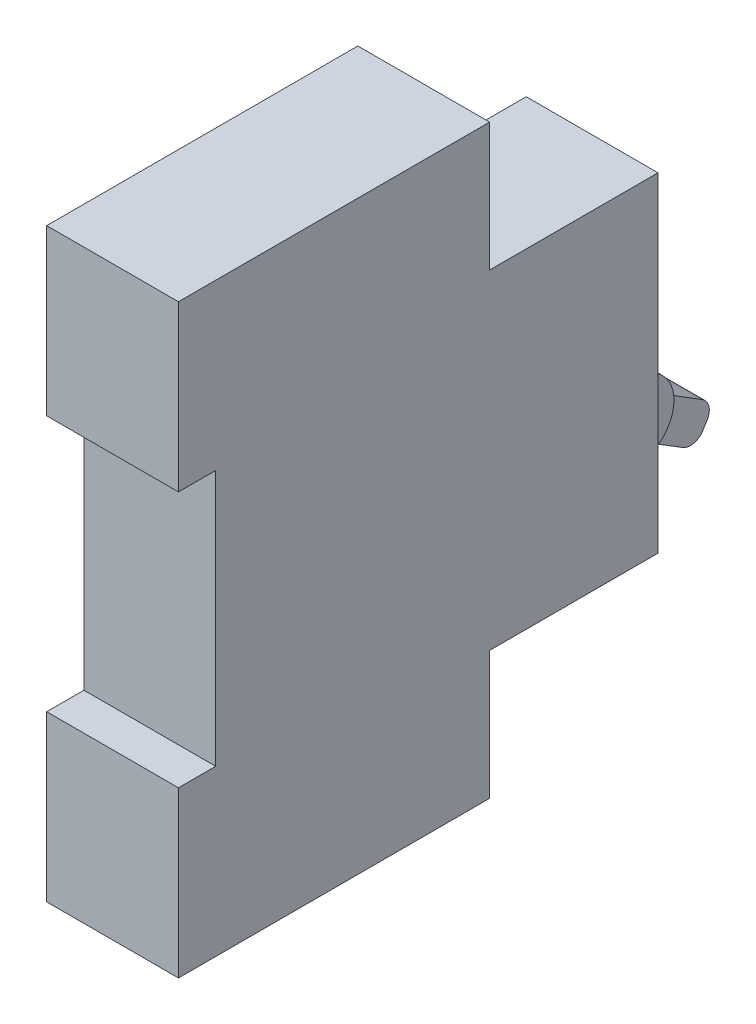
ISO-10303-21;
HEADER;
FILE_DESCRIPTION(('STEP AP214'),'2;1');
FILE_NAME('part.step','',(''),(''),'','','');
FILE_SCHEMA(('AUTOMOTIVE_DESIGN { 1 0 10303 214 1 1 1 1 }'));
ENDSEC;
DATA;
#1=APPLICATION_CONTEXT('core data for automotive mechanical design processes');
#2=APPLICATION_PROTOCOL_DEFINITION('international standard','automotive_design',2000,#1);
#3=PRODUCT_CONTEXT('',#1,'mechanical');
#4=PRODUCT('Part','Part','',(#3));
#5=PRODUCT_RELATED_PRODUCT_CATEGORY('part','',(#4));
#6=PRODUCT_DEFINITION_FORMATION('','',#4);
#7=PRODUCT_DEFINITION_CONTEXT('part definition',#1,'design');
#8=PRODUCT_DEFINITION('design','',#6,#7);
#9=PRODUCT_DEFINITION_SHAPE('','',#8);
#10=(LENGTH_UNIT() NAMED_UNIT(*) SI_UNIT(.MILLI.,.METRE.));
#11=(NAMED_UNIT(*) PLANE_ANGLE_UNIT() SI_UNIT($,.RADIAN.));
#12=(NAMED_UNIT(*) SI_UNIT($,.STERADIAN.) SOLID_ANGLE_UNIT());
#13=UNCERTAINTY_MEASURE_WITH_UNIT(LENGTH_MEASURE(1.E-05),#10,'distance_accuracy_value','');
#14=(GEOMETRIC_REPRESENTATION_CONTEXT(3) GLOBAL_UNCERTAINTY_ASSIGNED_CONTEXT((#13)) GLOBAL_UNIT_ASSIGNED_CONTEXT((#10,
#11,#12)) REPRESENTATION_CONTEXT('',''));
#15=CARTESIAN_POINT('',(0.,0.,0.));
#16=DIRECTION('',(0.,0.,1.));
#17=DIRECTION('',(1.,0.,0.));
#18=AXIS2_PLACEMENT_3D('',#15,#16,#17);
#19=CARTESIAN_POINT('',(-9.,22.5,-65.5));
#20=DIRECTION('',(0.,0.,-1.));
#21=DIRECTION('',(-1.,0.,0.));
#22=AXIS2_PLACEMENT_3D('',#19,#20,#21);
#23=PLANE('',#22);
#24=DIRECTION('',(1.,0.,0.));
#25=VECTOR('',#24,1.);
#26=CARTESIAN_POINT('',(-9.,22.5,-65.5));
#27=LINE('',#26,#25);
#28=CARTESIAN_POINT('',(-9.,22.5,-65.5));
#29=VERTEX_POINT('',#28);
#30=CARTESIAN_POINT('',(9.,22.5,-65.5));
#31=VERTEX_POINT('',#30);
#32=EDGE_CURVE('E328',#29,#31,#27,.T.);
#33=ORIENTED_EDGE('',*,*,#32,.T.);
#34=DIRECTION('',(0.,1.,0.));
#35=VECTOR('',#34,1.);
#36=CARTESIAN_POINT('',(9.,22.5,-65.5));
#37=LINE('',#36,#35);
#38=CARTESIAN_POINT('',(9.,-22.5,-65.5));
#39=VERTEX_POINT('',#38);
#40=EDGE_CURVE('E269',#39,#31,#37,.T.);
#41=ORIENTED_EDGE('',*,*,#40,.F.);
#42=DIRECTION('',(1.,0.,0.));
#43=VECTOR('',#42,1.);
#44=CARTESIAN_POINT('',(-9.,-22.5,-65.5));
#45=LINE('',#44,#43);
#46=CARTESIAN_POINT('',(-9.,-22.5,-65.5));
#47=VERTEX_POINT('',#46);
#48=EDGE_CURVE('E330',#47,#39,#45,.T.);
#49=ORIENTED_EDGE('',*,*,#48,.F.);
#50=DIRECTION('',(0.,1.,0.));
#51=VECTOR('',#50,1.);
#52=CARTESIAN_POINT('',(-9.,22.5,-65.5));
#53=LINE('',#52,#51);
#54=EDGE_CURVE('E305',#47,#29,#53,.T.);
#55=ORIENTED_EDGE('',*,*,#54,.T.);
#56=EDGE_LOOP('',(#33,#41,#49,#55));
#57=FACE_BOUND('',#56,.T.);
#58=DIRECTION('',(1.,0.,0.));
#59=VECTOR('',#58,1.);
#60=CARTESIAN_POINT('',(-6.,-3.30776483406985,-65.5));
#61=LINE('',#60,#59);
#62=CARTESIAN_POINT('',(-6.,-3.30776483406985,-65.5));
#63=VERTEX_POINT('',#62);
#64=CARTESIAN_POINT('',(6.,-3.30776483406985,-65.5));
#65=VERTEX_POINT('',#64);
#66=EDGE_CURVE('E243',#63,#65,#61,.T.);
#67=ORIENTED_EDGE('',*,*,#66,.F.);
#68=DIRECTION('',(0.,-1.,0.));
#69=VECTOR('',#68,1.);
#70=CARTESIAN_POINT('',(-6.,-3.30776483406985,-65.5));
#71=LINE('',#70,#69);
#72=CARTESIAN_POINT('',(-6.,-13.6686350822825,-65.5));
#73=VERTEX_POINT('',#72);
#74=EDGE_CURVE('E241',#63,#73,#71,.T.);
#75=ORIENTED_EDGE('',*,*,#74,.T.);
#76=DIRECTION('',(1.,0.,0.));
#77=VECTOR('',#76,1.);
#78=CARTESIAN_POINT('',(-6.,-13.6686350822825,-65.5));
#79=LINE('',#78,#77);
#80=CARTESIAN_POINT('',(6.,-13.6686350822825,-65.5));
#81=VERTEX_POINT('',#80);
#82=EDGE_CURVE('E244',#73,#81,#79,.T.);
#83=ORIENTED_EDGE('',*,*,#82,.T.);
#84=DIRECTION('',(0.,-1.,0.));
#85=VECTOR('',#84,1.);
#86=CARTESIAN_POINT('',(6.,-3.30776483406985,-65.5));
#87=LINE('',#86,#85);
#88=EDGE_CURVE('E235',#65,#81,#87,.T.);
#89=ORIENTED_EDGE('',*,*,#88,.F.);
#90=EDGE_LOOP('',(#67,#75,#83,#89));
#91=FACE_BOUND('',#90,.T.);
#92=ADVANCED_FACE('F35',(#57,#91),#23,.T.);
#93=CARTESIAN_POINT('',(-9.,17.5,0.));
#94=DIRECTION('',(0.,-1.,0.));
#95=DIRECTION('',(0.,0.,-1.));
#96=AXIS2_PLACEMENT_3D('',#93,#94,#95);
#97=PLANE('',#96);
#98=DIRECTION('',(1.,0.,0.));
#99=VECTOR('',#98,1.);
#100=CARTESIAN_POINT('',(-9.,17.5,-5.08495999200712));
#101=LINE('',#100,#99);
#102=CARTESIAN_POINT('',(-9.,17.5,-5.08495999200712));
#103=VERTEX_POINT('',#102);
#104=CARTESIAN_POINT('',(9.,17.5,-5.08495999200712));
#105=VERTEX_POINT('',#104);
#106=EDGE_CURVE('E320',#103,#105,#101,.T.);
#107=ORIENTED_EDGE('',*,*,#106,.T.);
#108=DIRECTION('',(0.,0.,-1.));
#109=VECTOR('',#108,1.);
#110=CARTESIAN_POINT('',(9.,17.5,0.));
#111=LINE('',#110,#109);
#112=CARTESIAN_POINT('',(9.,17.5,0.));
#113=VERTEX_POINT('',#112);
#114=EDGE_CURVE('E246',#113,#105,#111,.T.);
#115=ORIENTED_EDGE('',*,*,#114,.F.);
#116=DIRECTION('',(1.,0.,0.));
#117=VECTOR('',#116,1.);
#118=CARTESIAN_POINT('',(-9.,17.5,0.));
#119=LINE('',#118,#117);
#120=CARTESIAN_POINT('',(-9.,17.5,0.));
#121=VERTEX_POINT('',#120);
#122=EDGE_CURVE('E182',#121,#113,#119,.T.);
#123=ORIENTED_EDGE('',*,*,#122,.F.);
#124=DIRECTION('',(0.,0.,-1.));
#125=VECTOR('',#124,1.);
#126=CARTESIAN_POINT('',(-9.,17.5,0.));
#127=LINE('',#126,#125);
#128=EDGE_CURVE('E284',#121,#103,#127,.T.);
#129=ORIENTED_EDGE('',*,*,#128,.T.);
#130=EDGE_LOOP('',(#107,#115,#123,#129));
#131=FACE_BOUND('',#130,.T.);
#132=ADVANCED_FACE('F345',(#131),#97,.T.);
#133=CARTESIAN_POINT('',(-9.,17.5,0.));
#134=DIRECTION('',(0.,0.,1.));
#135=DIRECTION('',(0.,-1.,0.));
#136=AXIS2_PLACEMENT_3D('',#133,#134,#135);
#137=PLANE('',#136);
#138=ORIENTED_EDGE('',*,*,#122,.T.);
#139=DIRECTION('',(0.,-1.,0.));
#140=VECTOR('',#139,1.);
#141=CARTESIAN_POINT('',(9.,17.5,0.));
#142=LINE('',#141,#140);
#143=CARTESIAN_POINT('',(9.,40.,0.));
#144=VERTEX_POINT('',#143);
#145=EDGE_CURVE('E281',#144,#113,#142,.T.);
#146=ORIENTED_EDGE('',*,*,#145,.F.);
#147=DIRECTION('',(1.,0.,0.));
#148=VECTOR('',#147,1.);
#149=CARTESIAN_POINT('',(-9.,40.,0.));
#150=LINE('',#149,#148);
#151=CARTESIAN_POINT('',(-9.,40.,0.));
#152=VERTEX_POINT('',#151);
#153=EDGE_CURVE('E322',#152,#144,#150,.T.);
#154=ORIENTED_EDGE('',*,*,#153,.F.);
#155=DIRECTION('',(0.,-1.,0.));
#156=VECTOR('',#155,1.);
#157=CARTESIAN_POINT('',(-9.,17.5,0.));
#158=LINE('',#157,#156);
#159=EDGE_CURVE('E317',#152,#121,#158,.T.);
#160=ORIENTED_EDGE('',*,*,#159,.T.);
#161=EDGE_LOOP('',(#138,#146,#154,#160));
#162=FACE_BOUND('',#161,.T.);
#163=ADVANCED_FACE('F356',(#162),#137,.T.);
#164=CARTESIAN_POINT('',(-9.,40.,0.));
#165=DIRECTION('',(0.,1.,0.));
#166=DIRECTION('',(0.,0.,1.));
#167=AXIS2_PLACEMENT_3D('',#164,#165,#166);
#168=PLANE('',#167);
#169=ORIENTED_EDGE('',*,*,#153,.T.);
#170=DIRECTION('',(0.,0.,1.));
#171=VECTOR('',#170,1.);
#172=CARTESIAN_POINT('',(9.,40.,0.));
#173=LINE('',#172,#171);
#174=CARTESIAN_POINT('',(9.,40.,-42.5));
#175=VERTEX_POINT('',#174);
#176=EDGE_CURVE('E278',#175,#144,#173,.T.);
#177=ORIENTED_EDGE('',*,*,#176,.F.);
#178=DIRECTION('',(1.,0.,0.));
#179=VECTOR('',#178,1.);
#180=CARTESIAN_POINT('',(-9.,40.,-42.5));
#181=LINE('',#180,#179);
#182=CARTESIAN_POINT('',(-9.,40.,-42.5));
#183=VERTEX_POINT('',#182);
#184=EDGE_CURVE('E324',#183,#175,#181,.T.);
#185=ORIENTED_EDGE('',*,*,#184,.F.);
#186=DIRECTION('',(0.,0.,1.));
#187=VECTOR('',#186,1.);
#188=CARTESIAN_POINT('',(-9.,40.,0.));
#189=LINE('',#188,#187);
#190=EDGE_CURVE('E314',#183,#152,#189,.T.);
#191=ORIENTED_EDGE('',*,*,#190,.T.);
#192=EDGE_LOOP('',(#169,#177,#185,#191));
#193=FACE_BOUND('',#192,.T.);
#194=ADVANCED_FACE('F393',(#193),#168,.T.);
#195=CARTESIAN_POINT('',(-9.,40.,-42.5));
#196=DIRECTION('',(0.,0.,-1.));
#197=DIRECTION('',(-1.,0.,0.));
#198=AXIS2_PLACEMENT_3D('',#195,#196,#197);
#199=PLANE('',#198);
#200=ORIENTED_EDGE('',*,*,#184,.T.);
#201=DIRECTION('',(0.,1.,0.));
#202=VECTOR('',#201,1.);
#203=CARTESIAN_POINT('',(9.,40.,-42.5));
#204=LINE('',#203,#202);
#205=CARTESIAN_POINT('',(9.,22.5,-42.5));
#206=VERTEX_POINT('',#205);
#207=EDGE_CURVE('E275',#206,#175,#204,.T.);
#208=ORIENTED_EDGE('',*,*,#207,.F.);
#209=DIRECTION('',(1.,0.,0.));
#210=VECTOR('',#209,1.);
#211=CARTESIAN_POINT('',(-9.,22.5,-42.5));
#212=LINE('',#211,#210);
#213=CARTESIAN_POINT('',(-9.,22.5,-42.5));
#214=VERTEX_POINT('',#213);
#215=EDGE_CURVE('E326',#214,#206,#212,.T.);
#216=ORIENTED_EDGE('',*,*,#215,.F.);
#217=DIRECTION('',(0.,1.,0.));
#218=VECTOR('',#217,1.);
#219=CARTESIAN_POINT('',(-9.,40.,-42.5));
#220=LINE('',#219,#218);
#221=EDGE_CURVE('E311',#214,#183,#220,.T.);
#222=ORIENTED_EDGE('',*,*,#221,.T.);
#223=EDGE_LOOP('',(#200,#208,#216,#222));
#224=FACE_BOUND('',#223,.T.);
#225=ADVANCED_FACE('F391',(#224),#199,.T.);
#226=CARTESIAN_POINT('',(-9.,22.5,-42.5));
#227=DIRECTION('',(0.,1.,0.));
#228=DIRECTION('',(0.,0.,1.));
#229=AXIS2_PLACEMENT_3D('',#226,#227,#228);
#230=PLANE('',#229);
#231=ORIENTED_EDGE('',*,*,#215,.T.);
#232=DIRECTION('',(0.,0.,1.));
#233=VECTOR('',#232,1.);
#234=CARTESIAN_POINT('',(9.,22.5,-42.5));
#235=LINE('',#234,#233);
#236=EDGE_CURVE('E272',#31,#206,#235,.T.);
#237=ORIENTED_EDGE('',*,*,#236,.F.);
#238=ORIENTED_EDGE('',*,*,#32,.F.);
#239=DIRECTION('',(0.,0.,1.));
#240=VECTOR('',#239,1.);
#241=CARTESIAN_POINT('',(-9.,22.5,-42.5));
#242=LINE('',#241,#240);
#243=EDGE_CURVE('E308',#29,#214,#242,.T.);
#244=ORIENTED_EDGE('',*,*,#243,.T.);
#245=EDGE_LOOP('',(#231,#237,#238,#244));
#246=FACE_BOUND('',#245,.T.);
#247=ADVANCED_FACE('F387',(#246),#230,.T.);
#248=CARTESIAN_POINT('',(-9.,-22.5,-42.5));
#249=DIRECTION('',(0.,-1.,0.));
#250=DIRECTION('',(0.,0.,-1.));
#251=AXIS2_PLACEMENT_3D('',#248,#249,#250);
#252=PLANE('',#251);
#253=ORIENTED_EDGE('',*,*,#48,.T.);
#254=DIRECTION('',(0.,0.,-1.));
#255=VECTOR('',#254,1.);
#256=CARTESIAN_POINT('',(9.,-22.5,-42.5));
#257=LINE('',#256,#255);
#258=CARTESIAN_POINT('',(9.,-22.5,-42.5));
#259=VERTEX_POINT('',#258);
#260=EDGE_CURVE('E266',#259,#39,#257,.T.);
#261=ORIENTED_EDGE('',*,*,#260,.F.);
#262=DIRECTION('',(1.,0.,0.));
#263=VECTOR('',#262,1.);
#264=CARTESIAN_POINT('',(-9.,-22.5,-42.5));
#265=LINE('',#264,#263);
#266=CARTESIAN_POINT('',(-9.,-22.5,-42.5));
#267=VERTEX_POINT('',#266);
#268=EDGE_CURVE('E332',#267,#259,#265,.T.);
#269=ORIENTED_EDGE('',*,*,#268,.F.);
#270=DIRECTION('',(0.,0.,-1.));
#271=VECTOR('',#270,1.);
#272=CARTESIAN_POINT('',(-9.,-22.5,-42.5));
#273=LINE('',#272,#271);
#274=EDGE_CURVE('E302',#267,#47,#273,.T.);
#275=ORIENTED_EDGE('',*,*,#274,.T.);
#276=EDGE_LOOP('',(#253,#261,#269,#275));
#277=FACE_BOUND('',#276,.T.);
#278=ADVANCED_FACE('F381',(#277),#252,.T.);
#279=CARTESIAN_POINT('',(-9.,-40.,-42.5));
#280=DIRECTION('',(0.,0.,-1.));
#281=DIRECTION('',(-1.,0.,0.));
#282=AXIS2_PLACEMENT_3D('',#279,#280,#281);
#283=PLANE('',#282);
#284=ORIENTED_EDGE('',*,*,#268,.T.);
#285=DIRECTION('',(0.,1.,0.));
#286=VECTOR('',#285,1.);
#287=CARTESIAN_POINT('',(9.,-40.,-42.5));
#288=LINE('',#287,#286);
#289=CARTESIAN_POINT('',(9.,-40.,-42.5));
#290=VERTEX_POINT('',#289);
#291=EDGE_CURVE('E263',#290,#259,#288,.T.);
#292=ORIENTED_EDGE('',*,*,#291,.F.);
#293=DIRECTION('',(1.,0.,0.));
#294=VECTOR('',#293,1.);
#295=CARTESIAN_POINT('',(-9.,-40.,-42.5));
#296=LINE('',#295,#294);
#297=CARTESIAN_POINT('',(-9.,-40.,-42.5));
#298=VERTEX_POINT('',#297);
#299=EDGE_CURVE('E334',#298,#290,#296,.T.);
#300=ORIENTED_EDGE('',*,*,#299,.F.);
#301=DIRECTION('',(0.,1.,0.));
#302=VECTOR('',#301,1.);
#303=CARTESIAN_POINT('',(-9.,-40.,-42.5));
#304=LINE('',#303,#302);
#305=EDGE_CURVE('E299',#298,#267,#304,.T.);
#306=ORIENTED_EDGE('',*,*,#305,.T.);
#307=EDGE_LOOP('',(#284,#292,#300,#306));
#308=FACE_BOUND('',#307,.T.);
#309=ADVANCED_FACE('F376',(#308),#283,.T.);
#310=CARTESIAN_POINT('',(-9.,-40.,0.));
#311=DIRECTION('',(0.,-1.,0.));
#312=DIRECTION('',(0.,0.,-1.));
#313=AXIS2_PLACEMENT_3D('',#310,#311,#312);
#314=PLANE('',#313);
#315=ORIENTED_EDGE('',*,*,#299,.T.);
#316=DIRECTION('',(0.,0.,-1.));
#317=VECTOR('',#316,1.);
#318=CARTESIAN_POINT('',(9.,-40.,0.));
#319=LINE('',#318,#317);
#320=CARTESIAN_POINT('',(9.,-40.,0.));
#321=VERTEX_POINT('',#320);
#322=EDGE_CURVE('E260',#321,#290,#319,.T.);
#323=ORIENTED_EDGE('',*,*,#322,.F.);
#324=DIRECTION('',(1.,0.,0.));
#325=VECTOR('',#324,1.);
#326=CARTESIAN_POINT('',(-9.,-40.,0.));
#327=LINE('',#326,#325);
#328=CARTESIAN_POINT('',(-9.,-40.,0.));
#329=VERTEX_POINT('',#328);
#330=EDGE_CURVE('E336',#329,#321,#327,.T.);
#331=ORIENTED_EDGE('',*,*,#330,.F.);
#332=DIRECTION('',(0.,0.,-1.));
#333=VECTOR('',#332,1.);
#334=CARTESIAN_POINT('',(-9.,-40.,0.));
#335=LINE('',#334,#333);
#336=EDGE_CURVE('E296',#329,#298,#335,.T.);
#337=ORIENTED_EDGE('',*,*,#336,.T.);
#338=EDGE_LOOP('',(#315,#323,#331,#337));
#339=FACE_BOUND('',#338,.T.);
#340=ADVANCED_FACE('F371',(#339),#314,.T.);
#341=CARTESIAN_POINT('',(-9.,-17.5,0.));
#342=DIRECTION('',(0.,0.,1.));
#343=DIRECTION('',(0.,-1.,0.));
#344=AXIS2_PLACEMENT_3D('',#341,#342,#343);
#345=PLANE('',#344);
#346=ORIENTED_EDGE('',*,*,#330,.T.);
#347=DIRECTION('',(0.,-1.,0.));
#348=VECTOR('',#347,1.);
#349=CARTESIAN_POINT('',(9.,-17.5,0.));
#350=LINE('',#349,#348);
#351=CARTESIAN_POINT('',(9.,-17.5,0.));
#352=VERTEX_POINT('',#351);
#353=EDGE_CURVE('E257',#352,#321,#350,.T.);
#354=ORIENTED_EDGE('',*,*,#353,.F.);
#355=DIRECTION('',(1.,0.,0.));
#356=VECTOR('',#355,1.);
#357=CARTESIAN_POINT('',(-9.,-17.5,0.));
#358=LINE('',#357,#356);
#359=CARTESIAN_POINT('',(-9.,-17.5,0.));
#360=VERTEX_POINT('',#359);
#361=EDGE_CURVE('E338',#360,#352,#358,.T.);
#362=ORIENTED_EDGE('',*,*,#361,.F.);
#363=DIRECTION('',(0.,-1.,0.));
#364=VECTOR('',#363,1.);
#365=CARTESIAN_POINT('',(-9.,-17.5,0.));
#366=LINE('',#365,#364);
#367=EDGE_CURVE('E293',#360,#329,#366,.T.);
#368=ORIENTED_EDGE('',*,*,#367,.T.);
#369=EDGE_LOOP('',(#346,#354,#362,#368));
#370=FACE_BOUND('',#369,.T.);
#371=ADVANCED_FACE('F369',(#370),#345,.T.);
#372=CARTESIAN_POINT('',(-9.,-17.5,0.));
#373=DIRECTION('',(0.,1.,0.));
#374=DIRECTION('',(0.,0.,1.));
#375=AXIS2_PLACEMENT_3D('',#372,#373,#374);
#376=PLANE('',#375);
#377=ORIENTED_EDGE('',*,*,#361,.T.);
#378=DIRECTION('',(0.,0.,1.));
#379=VECTOR('',#378,1.);
#380=CARTESIAN_POINT('',(9.,-17.5,0.));
#381=LINE('',#380,#379);
#382=CARTESIAN_POINT('',(9.,-17.5,-5.08495999200712));
#383=VERTEX_POINT('',#382);
#384=EDGE_CURVE('E254',#383,#352,#381,.T.);
#385=ORIENTED_EDGE('',*,*,#384,.F.);
#386=DIRECTION('',(1.,0.,0.));
#387=VECTOR('',#386,1.);
#388=CARTESIAN_POINT('',(-9.,-17.5,-5.08495999200712));
#389=LINE('',#388,#387);
#390=CARTESIAN_POINT('',(-9.,-17.5,-5.08495999200712));
#391=VERTEX_POINT('',#390);
#392=EDGE_CURVE('E340',#391,#383,#389,.T.);
#393=ORIENTED_EDGE('',*,*,#392,.F.);
#394=DIRECTION('',(0.,0.,1.));
#395=VECTOR('',#394,1.);
#396=CARTESIAN_POINT('',(-9.,-17.5,0.));
#397=LINE('',#396,#395);
#398=EDGE_CURVE('E290',#391,#360,#397,.T.);
#399=ORIENTED_EDGE('',*,*,#398,.T.);
#400=EDGE_LOOP('',(#377,#385,#393,#399));
#401=FACE_BOUND('',#400,.T.);
#402=ADVANCED_FACE('F365',(#401),#376,.T.);
#403=CARTESIAN_POINT('',(-9.,17.5,-5.08495999200712));
#404=DIRECTION('',(0.,0.,1.));
#405=DIRECTION('',(1.,0.,0.));
#406=AXIS2_PLACEMENT_3D('',#403,#404,#405);
#407=PLANE('',#406);
#408=ORIENTED_EDGE('',*,*,#392,.T.);
#409=DIRECTION('',(0.,-1.,0.));
#410=VECTOR('',#409,1.);
#411=CARTESIAN_POINT('',(9.,17.5,-5.08495999200712));
#412=LINE('',#411,#410);
#413=EDGE_CURVE('E251',#105,#383,#412,.T.);
#414=ORIENTED_EDGE('',*,*,#413,.F.);
#415=ORIENTED_EDGE('',*,*,#106,.F.);
#416=DIRECTION('',(0.,-1.,0.));
#417=VECTOR('',#416,1.);
#418=CARTESIAN_POINT('',(-9.,17.5,-5.08495999200712));
#419=LINE('',#418,#417);
#420=EDGE_CURVE('E287',#103,#391,#419,.T.);
#421=ORIENTED_EDGE('',*,*,#420,.T.);
#422=EDGE_LOOP('',(#408,#414,#415,#421));
#423=FACE_BOUND('',#422,.T.);
#424=ADVANCED_FACE('F349',(#423),#407,.T.);
#425=CARTESIAN_POINT('',(-9.,0.,0.));
#426=DIRECTION('',(-1.,0.,0.));
#427=DIRECTION('',(0.,0.,1.));
#428=AXIS2_PLACEMENT_3D('',#425,#426,#427);
#429=PLANE('',#428);
#430=ORIENTED_EDGE('',*,*,#128,.F.);
#431=ORIENTED_EDGE('',*,*,#159,.F.);
#432=ORIENTED_EDGE('',*,*,#190,.F.);
#433=ORIENTED_EDGE('',*,*,#221,.F.);
#434=ORIENTED_EDGE('',*,*,#243,.F.);
#435=ORIENTED_EDGE('',*,*,#54,.F.);
#436=ORIENTED_EDGE('',*,*,#274,.F.);
#437=ORIENTED_EDGE('',*,*,#305,.F.);
#438=ORIENTED_EDGE('',*,*,#336,.F.);
#439=ORIENTED_EDGE('',*,*,#367,.F.);
#440=ORIENTED_EDGE('',*,*,#398,.F.);
#441=ORIENTED_EDGE('',*,*,#420,.F.);
#442=EDGE_LOOP('',(#430,#431,#432,#433,#434,#435,#436,#437,#438,#439,#440,#441));
#443=FACE_BOUND('',#442,.T.);
#444=ADVANCED_FACE('F359',(#443),#429,.T.);
#445=CARTESIAN_POINT('',(9.,0.,0.));
#446=DIRECTION('',(-1.,0.,0.));
#447=DIRECTION('',(0.,0.,1.));
#448=AXIS2_PLACEMENT_3D('',#445,#446,#447);
#449=PLANE('',#448);
#450=ORIENTED_EDGE('',*,*,#114,.T.);
#451=ORIENTED_EDGE('',*,*,#413,.T.);
#452=ORIENTED_EDGE('',*,*,#384,.T.);
#453=ORIENTED_EDGE('',*,*,#353,.T.);
#454=ORIENTED_EDGE('',*,*,#322,.T.);
#455=ORIENTED_EDGE('',*,*,#291,.T.);
#456=ORIENTED_EDGE('',*,*,#260,.T.);
#457=ORIENTED_EDGE('',*,*,#40,.T.);
#458=ORIENTED_EDGE('',*,*,#236,.T.);
#459=ORIENTED_EDGE('',*,*,#207,.T.);
#460=ORIENTED_EDGE('',*,*,#176,.T.);
#461=ORIENTED_EDGE('',*,*,#145,.T.);
#462=EDGE_LOOP('',(#450,#451,#452,#453,#454,#455,#456,#457,#458,#459,#460,#461));
#463=FACE_BOUND('',#462,.T.);
#464=ADVANCED_FACE('F352',(#463),#449,.F.);
#465=CARTESIAN_POINT('',(-6.,-8.48819995817616,-65.5));
#466=DIRECTION('',(1.,0.,0.));
#467=DIRECTION('',(0.,0.,-1.));
#468=AXIS2_PLACEMENT_3D('',#465,#466,#467);
#469=CYLINDRICAL_SURFACE('',#468,5.1804351241063);
#470=CARTESIAN_POINT('',(-4.,-8.48819995817616,-65.5));
#471=DIRECTION('',(-1.,0.,0.));
#472=DIRECTION('',(0.,0.,1.));
#473=AXIS2_PLACEMENT_3D('',#470,#471,#472);
#474=CIRCLE('',#473,5.1804351241063);
#475=CARTESIAN_POINT('',(-4.,-13.0330015049833,-67.9862998562551));
#476=VERTEX_POINT('',#475);
#477=CARTESIAN_POINT('',(-4.,-8.70298361467207,-70.6759806854331));
#478=VERTEX_POINT('',#477);
#479=EDGE_CURVE('E198',#476,#478,#474,.F.);
#480=ORIENTED_EDGE('',*,*,#479,.F.);
#481=DIRECTION('',(1.,0.,0.));
#482=VECTOR('',#481,1.);
#483=CARTESIAN_POINT('',(-6.,-13.0330015049833,-67.9862998562551));
#484=LINE('',#483,#482);
#485=CARTESIAN_POINT('',(4.,-13.0330015049833,-67.9862998562551));
#486=VERTEX_POINT('',#485);
#487=EDGE_CURVE('E188',#486,#476,#484,.F.);
#488=ORIENTED_EDGE('',*,*,#487,.F.);
#489=CARTESIAN_POINT('',(4.,-8.48819995817616,-65.5));
#490=DIRECTION('',(-1.,0.,0.));
#491=DIRECTION('',(0.,0.,1.));
#492=AXIS2_PLACEMENT_3D('',#489,#490,#491);
#493=CIRCLE('',#492,5.1804351241063);
#494=CARTESIAN_POINT('',(4.,-8.70298361467207,-70.6759806854331));
#495=VERTEX_POINT('',#494);
#496=EDGE_CURVE('E172',#486,#495,#493,.F.);
#497=ORIENTED_EDGE('',*,*,#496,.T.);
#498=DIRECTION('',(1.,0.,0.));
#499=VECTOR('',#498,1.);
#500=CARTESIAN_POINT('',(-6.,-8.70298361467207,-70.6759806854331));
#501=LINE('',#500,#499);
#502=EDGE_CURVE('E181',#478,#495,#501,.T.);
#503=ORIENTED_EDGE('',*,*,#502,.F.);
#504=EDGE_LOOP('',(#480,#488,#497,#503));
#505=FACE_BOUND('',#504,.T.);
#506=ORIENTED_EDGE('',*,*,#66,.T.);
#507=CARTESIAN_POINT('',(6.,-8.48819995817616,-65.5));
#508=DIRECTION('',(1.,0.,0.));
#509=DIRECTION('',(0.,0.,-1.));
#510=AXIS2_PLACEMENT_3D('',#507,#508,#509);
#511=CIRCLE('',#510,5.1804351241063);
#512=EDGE_CURVE('E232',#81,#65,#511,.T.);
#513=ORIENTED_EDGE('',*,*,#512,.F.);
#514=ORIENTED_EDGE('',*,*,#82,.F.);
#515=CARTESIAN_POINT('',(-6.,-8.48819995817616,-65.5));
#516=DIRECTION('',(1.,0.,0.));
#517=DIRECTION('',(0.,0.,-1.));
#518=AXIS2_PLACEMENT_3D('',#515,#516,#517);
#519=CIRCLE('',#518,5.1804351241063);
#520=EDGE_CURVE('E238',#73,#63,#519,.T.);
#521=ORIENTED_EDGE('',*,*,#520,.T.);
#522=EDGE_LOOP('',(#506,#513,#514,#521));
#523=FACE_BOUND('',#522,.T.);
#524=ADVANCED_FACE('F195',(#505,#523),#469,.T.);
#525=CARTESIAN_POINT('',(-6.,-8.48819995817616,-65.5));
#526=DIRECTION('',(1.,0.,0.));
#527=DIRECTION('',(0.,0.,-1.));
#528=AXIS2_PLACEMENT_3D('',#525,#526,#527);
#529=PLANE('',#528);
#530=ORIENTED_EDGE('',*,*,#520,.F.);
#531=ORIENTED_EDGE('',*,*,#74,.F.);
#532=EDGE_LOOP('',(#530,#531));
#533=FACE_BOUND('',#532,.T.);
#534=ADVANCED_FACE('F443',(#533),#529,.F.);
#535=CARTESIAN_POINT('',(6.,-8.48819995817616,-65.5));
#536=DIRECTION('',(1.,0.,0.));
#537=DIRECTION('',(0.,0.,-1.));
#538=AXIS2_PLACEMENT_3D('',#535,#536,#537);
#539=PLANE('',#538);
#540=ORIENTED_EDGE('',*,*,#512,.T.);
#541=ORIENTED_EDGE('',*,*,#88,.T.);
#542=EDGE_LOOP('',(#540,#541));
#543=FACE_BOUND('',#542,.T.);
#544=ADVANCED_FACE('F440',(#543),#539,.T.);
#545=CARTESIAN_POINT('',(-4.,-12.498830138094,-67.1263570890572));
#546=DIRECTION('',(0.,-0.849456970615492,0.527657895868858));
#547=DIRECTION('',(0.,-0.527657895868858,-0.849456970615492));
#548=AXIS2_PLACEMENT_3D('',#545,#546,#547);
#549=PLANE('',#548);
#550=DIRECTION('',(0.,-0.527657895868858,-0.849456970615492));
#551=VECTOR('',#550,1.);
#552=CARTESIAN_POINT('',(-4.,-12.498830138094,-67.1263570890572));
#553=LINE('',#552,#551);
#554=CARTESIAN_POINT('',(-4.,-16.6924400189218,-73.8774948493393));
#555=VERTEX_POINT('',#554);
#556=EDGE_CURVE('E215',#476,#555,#553,.T.);
#557=ORIENTED_EDGE('',*,*,#556,.T.);
#558=DIRECTION('',(1.,0.,0.));
#559=VECTOR('',#558,1.);
#560=CARTESIAN_POINT('',(-4.,-16.6924400189218,-73.8774948493393));
#561=LINE('',#560,#559);
#562=CARTESIAN_POINT('',(4.,-16.6924400189218,-73.8774948493393));
#563=VERTEX_POINT('',#562);
#564=EDGE_CURVE('E191',#555,#563,#561,.T.);
#565=ORIENTED_EDGE('',*,*,#564,.T.);
#566=DIRECTION('',(0.,-0.527657895868858,-0.849456970615492));
#567=VECTOR('',#566,1.);
#568=CARTESIAN_POINT('',(4.,-12.498830138094,-67.1263570890572));
#569=LINE('',#568,#567);
#570=EDGE_CURVE('E175',#486,#563,#569,.T.);
#571=ORIENTED_EDGE('',*,*,#570,.F.);
#572=ORIENTED_EDGE('',*,*,#487,.T.);
#573=EDGE_LOOP('',(#557,#565,#571,#572));
#574=FACE_BOUND('',#573,.T.);
#575=ADVANCED_FACE('F187',(#574),#549,.T.);
#576=CARTESIAN_POINT('',(-4.,-8.16881224778278,-69.8160379182352));
#577=DIRECTION('',(0.,0.849456970615491,-0.527657895868859));
#578=DIRECTION('',(0.,0.527657895868859,0.849456970615491));
#579=AXIS2_PLACEMENT_3D('',#576,#577,#578);
#580=PLANE('',#579);
#581=DIRECTION('',(0.,0.527657895868859,0.849456970615491));
#582=VECTOR('',#581,1.);
#583=CARTESIAN_POINT('',(4.,-8.16881224778278,-69.8160379182352));
#584=LINE('',#583,#582);
#585=CARTESIAN_POINT('',(4.,-12.3624221286107,-76.5671756785173));
#586=VERTEX_POINT('',#585);
#587=EDGE_CURVE('E176',#586,#495,#584,.T.);
#588=ORIENTED_EDGE('',*,*,#587,.F.);
#589=DIRECTION('',(1.,0.,0.));
#590=VECTOR('',#589,1.);
#591=CARTESIAN_POINT('',(-4.,-12.3624221286107,-76.5671756785173));
#592=LINE('',#591,#590);
#593=CARTESIAN_POINT('',(-4.,-12.3624221286107,-76.5671756785173));
#594=VERTEX_POINT('',#593);
#595=EDGE_CURVE('E11',#586,#594,#592,.F.);
#596=ORIENTED_EDGE('',*,*,#595,.T.);
#597=DIRECTION('',(0.,0.527657895868859,0.849456970615491));
#598=VECTOR('',#597,1.);
#599=CARTESIAN_POINT('',(-4.,-8.16881224778278,-69.8160379182352));
#600=LINE('',#599,#598);
#601=EDGE_CURVE('E230',#594,#478,#600,.T.);
#602=ORIENTED_EDGE('',*,*,#601,.T.);
#603=ORIENTED_EDGE('',*,*,#502,.T.);
#604=EDGE_LOOP('',(#588,#596,#602,#603));
#605=FACE_BOUND('',#604,.T.);
#606=ADVANCED_FACE('F433',(#605),#580,.T.);
#607=CARTESIAN_POINT('',(-4.,-13.4177379203484,-78.2660896197482));
#608=DIRECTION('',(0.,-0.527657895868858,-0.849456970615493));
#609=DIRECTION('',(0.,0.849456970615493,-0.527657895868858));
#610=AXIS2_PLACEMENT_3D('',#607,#608,#609);
#611=PLANE('',#610);
#612=DIRECTION('',(0.,0.849456970615493,-0.527657895868858));
#613=VECTOR('',#612,1.);
#614=CARTESIAN_POINT('',(4.,-13.4177379203484,-78.2660896197482));
#615=LINE('',#614,#613);
#616=CARTESIAN_POINT('',(4.,-16.0488418694286,-76.631724582308));
#617=VERTEX_POINT('',#616);
#618=CARTESIAN_POINT('',(4.,-15.1166518615794,-77.2107738280105));
#619=VERTEX_POINT('',#618);
#620=EDGE_CURVE('E192',#617,#619,#615,.T.);
#621=ORIENTED_EDGE('',*,*,#620,.F.);
#622=DIRECTION('',(1.,0.,0.));
#623=VECTOR('',#622,1.);
#624=CARTESIAN_POINT('',(-4.,-16.0488418694286,-76.631724582308));
#625=LINE('',#624,#623);
#626=CARTESIAN_POINT('',(-4.,-16.0488418694286,-76.631724582308));
#627=VERTEX_POINT('',#626);
#628=EDGE_CURVE('E211',#617,#627,#625,.F.);
#629=ORIENTED_EDGE('',*,*,#628,.T.);
#630=DIRECTION('',(0.,0.849456970615493,-0.527657895868858));
#631=VECTOR('',#630,1.);
#632=CARTESIAN_POINT('',(-4.,-13.4177379203484,-78.2660896197482));
#633=LINE('',#632,#631);
#634=CARTESIAN_POINT('',(-4.,-15.1166518615794,-77.2107738280105));
#635=VERTEX_POINT('',#634);
#636=EDGE_CURVE('E216',#627,#635,#633,.T.);
#637=ORIENTED_EDGE('',*,*,#636,.T.);
#638=DIRECTION('',(1.,0.,0.));
#639=VECTOR('',#638,1.);
#640=CARTESIAN_POINT('',(-4.,-15.1166518615794,-77.2107738280105));
#641=LINE('',#640,#639);
#642=EDGE_CURVE('E208',#635,#619,#641,.T.);
#643=ORIENTED_EDGE('',*,*,#642,.T.);
#644=EDGE_LOOP('',(#621,#629,#637,#643));
#645=FACE_BOUND('',#644,.T.);
#646=ADVANCED_FACE('F224',(#645),#611,.T.);
#647=CARTESIAN_POINT('',(-4.,0.,0.));
#648=DIRECTION('',(-1.,0.,0.));
#649=DIRECTION('',(0.,0.,1.));
#650=AXIS2_PLACEMENT_3D('',#647,#648,#649);
#651=PLANE('',#650);
#652=ORIENTED_EDGE('',*,*,#636,.F.);
#653=CARTESIAN_POINT('',(-4.,-14.9935260776909,-74.932810641077));
#654=DIRECTION('',(-1.,0.,0.));
#655=DIRECTION('',(0.,0.,1.));
#656=AXIS2_PLACEMENT_3D('',#653,#654,#655);
#657=CIRCLE('',#656,2.);
#658=EDGE_CURVE('E43',#627,#555,#657,.T.);
#659=ORIENTED_EDGE('',*,*,#658,.T.);
#660=ORIENTED_EDGE('',*,*,#556,.F.);
#661=ORIENTED_EDGE('',*,*,#479,.T.);
#662=ORIENTED_EDGE('',*,*,#601,.F.);
#663=CARTESIAN_POINT('',(-4.,-14.0613360698417,-75.5118598867795));
#664=DIRECTION('',(-1.,0.,0.));
#665=DIRECTION('',(0.,0.,1.));
#666=AXIS2_PLACEMENT_3D('',#663,#664,#665);
#667=CIRCLE('',#666,2.);
#668=EDGE_CURVE('E55',#594,#635,#667,.T.);
#669=ORIENTED_EDGE('',*,*,#668,.T.);
#670=EDGE_LOOP('',(#652,#659,#660,#661,#662,#669));
#671=FACE_BOUND('',#670,.T.);
#672=ADVANCED_FACE('F214',(#671),#651,.T.);
#673=CARTESIAN_POINT('',(4.,0.,0.));
#674=DIRECTION('',(-1.,0.,0.));
#675=DIRECTION('',(0.,0.,1.));
#676=AXIS2_PLACEMENT_3D('',#673,#674,#675);
#677=PLANE('',#676);
#678=ORIENTED_EDGE('',*,*,#570,.T.);
#679=CARTESIAN_POINT('',(4.,-14.9935260776909,-74.932810641077));
#680=DIRECTION('',(-1.,0.,0.));
#681=DIRECTION('',(0.,0.,1.));
#682=AXIS2_PLACEMENT_3D('',#679,#680,#681);
#683=CIRCLE('',#682,2.);
#684=EDGE_CURVE('E206',#563,#617,#683,.F.);
#685=ORIENTED_EDGE('',*,*,#684,.T.);
#686=ORIENTED_EDGE('',*,*,#620,.T.);
#687=CARTESIAN_POINT('',(4.,-14.0613360698417,-75.5118598867795));
#688=DIRECTION('',(-1.,0.,0.));
#689=DIRECTION('',(0.,0.,1.));
#690=AXIS2_PLACEMENT_3D('',#687,#688,#689);
#691=CIRCLE('',#690,2.);
#692=EDGE_CURVE('E204',#619,#586,#691,.F.);
#693=ORIENTED_EDGE('',*,*,#692,.T.);
#694=ORIENTED_EDGE('',*,*,#587,.T.);
#695=ORIENTED_EDGE('',*,*,#496,.F.);
#696=EDGE_LOOP('',(#678,#685,#686,#693,#694,#695));
#697=FACE_BOUND('',#696,.T.);
#698=ADVANCED_FACE('F174',(#697),#677,.F.);
#699=CARTESIAN_POINT('',(-4.,-14.9935260776909,-74.932810641077));
#700=DIRECTION('',(1.,0.,0.));
#701=DIRECTION('',(0.,0.,-1.));
#702=AXIS2_PLACEMENT_3D('',#699,#700,#701);
#703=CYLINDRICAL_SURFACE('',#702,2.);
#704=ORIENTED_EDGE('',*,*,#658,.F.);
#705=ORIENTED_EDGE('',*,*,#628,.F.);
#706=ORIENTED_EDGE('',*,*,#684,.F.);
#707=ORIENTED_EDGE('',*,*,#564,.F.);
#708=EDGE_LOOP('',(#704,#705,#706,#707));
#709=FACE_BOUND('',#708,.T.);
#710=ADVANCED_FACE('F220',(#709),#703,.T.);
#711=CARTESIAN_POINT('',(-4.,-14.0613360698417,-75.5118598867795));
#712=DIRECTION('',(1.,0.,0.));
#713=DIRECTION('',(0.,0.,-1.));
#714=AXIS2_PLACEMENT_3D('',#711,#712,#713);
#715=CYLINDRICAL_SURFACE('',#714,2.);
#716=ORIENTED_EDGE('',*,*,#668,.F.);
#717=ORIENTED_EDGE('',*,*,#595,.F.);
#718=ORIENTED_EDGE('',*,*,#692,.F.);
#719=ORIENTED_EDGE('',*,*,#642,.F.);
#720=EDGE_LOOP('',(#716,#717,#718,#719));
#721=FACE_BOUND('',#720,.T.);
#722=ADVANCED_FACE('F37',(#721),#715,.T.);
#723=CLOSED_SHELL('',(#92,#132,#163,#194,#225,#247,#278,#309,#340,#371,#402,#424,#444,#464,#524,
#534,#544,#575,#606,#646,#672,#698,#710,#722));
#724=MANIFOLD_SOLID_BREP('B2',#723);
#725=ADVANCED_BREP_SHAPE_REPRESENTATION('',(#18,#724),#14);
#726=SHAPE_DEFINITION_REPRESENTATION(#9,#725);
ENDSEC;
END-ISO-10303-21;
